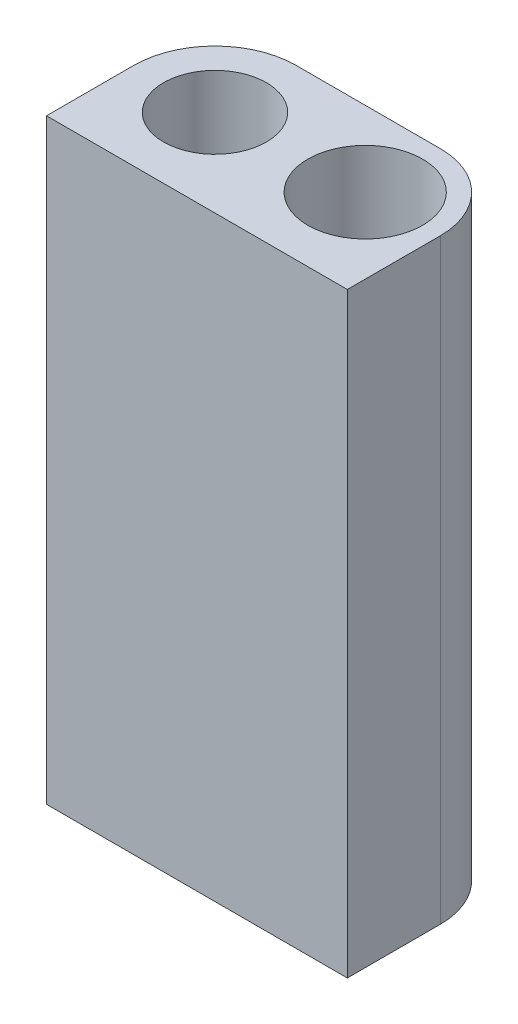
ISO-10303-21;
HEADER;
FILE_DESCRIPTION(('STEP AP214'),'2;1');
FILE_NAME('part.step','',(''),(''),'','','');
FILE_SCHEMA(('AUTOMOTIVE_DESIGN { 1 0 10303 214 1 1 1 1 }'));
ENDSEC;
DATA;
#1=APPLICATION_CONTEXT('core data for automotive mechanical design processes');
#2=APPLICATION_PROTOCOL_DEFINITION('international standard','automotive_design',2000,#1);
#3=PRODUCT_CONTEXT('',#1,'mechanical');
#4=PRODUCT('Part','Part','',(#3));
#5=PRODUCT_RELATED_PRODUCT_CATEGORY('part','',(#4));
#6=PRODUCT_DEFINITION_FORMATION('','',#4);
#7=PRODUCT_DEFINITION_CONTEXT('part definition',#1,'design');
#8=PRODUCT_DEFINITION('design','',#6,#7);
#9=PRODUCT_DEFINITION_SHAPE('','',#8);
#10=(LENGTH_UNIT() NAMED_UNIT(*) SI_UNIT(.MILLI.,.METRE.));
#11=(NAMED_UNIT(*) PLANE_ANGLE_UNIT() SI_UNIT($,.RADIAN.));
#12=(NAMED_UNIT(*) SI_UNIT($,.STERADIAN.) SOLID_ANGLE_UNIT());
#13=UNCERTAINTY_MEASURE_WITH_UNIT(LENGTH_MEASURE(1.E-05),#10,'distance_accuracy_value','');
#14=(GEOMETRIC_REPRESENTATION_CONTEXT(3) GLOBAL_UNCERTAINTY_ASSIGNED_CONTEXT((#13)) GLOBAL_UNIT_ASSIGNED_CONTEXT((#10,
#11,#12)) REPRESENTATION_CONTEXT('',''));
#15=CARTESIAN_POINT('',(0.,0.,0.));
#16=DIRECTION('',(0.,0.,1.));
#17=DIRECTION('',(1.,0.,0.));
#18=AXIS2_PLACEMENT_3D('',#15,#16,#17);
#19=CARTESIAN_POINT('',(0.,40.,-5.45));
#20=DIRECTION('',(0.,0.,-1.));
#21=DIRECTION('',(-1.,0.,0.));
#22=AXIS2_PLACEMENT_3D('',#19,#20,#21);
#23=PLANE('',#22);
#24=DIRECTION('',(1.,0.,0.));
#25=VECTOR('',#24,1.);
#26=CARTESIAN_POINT('',(0.,0.,-5.45));
#27=LINE('',#26,#25);
#28=CARTESIAN_POINT('',(0.,0.,-5.45));
#29=VERTEX_POINT('',#28);
#30=CARTESIAN_POINT('',(9.67916439970916,0.,-5.45));
#31=VERTEX_POINT('',#30);
#32=EDGE_CURVE('E124',#29,#31,#27,.T.);
#33=ORIENTED_EDGE('',*,*,#32,.F.);
#34=DIRECTION('',(0.,-1.,0.));
#35=VECTOR('',#34,1.);
#36=CARTESIAN_POINT('',(0.,40.,-5.45));
#37=LINE('',#36,#35);
#38=CARTESIAN_POINT('',(0.,40.,-5.45));
#39=VERTEX_POINT('',#38);
#40=EDGE_CURVE('E11',#39,#29,#37,.T.);
#41=ORIENTED_EDGE('',*,*,#40,.F.);
#42=DIRECTION('',(1.,0.,0.));
#43=VECTOR('',#42,1.);
#44=CARTESIAN_POINT('',(0.,40.,-5.45));
#45=LINE('',#44,#43);
#46=CARTESIAN_POINT('',(9.67916439970916,40.,-5.45));
#47=VERTEX_POINT('',#46);
#48=EDGE_CURVE('E249',#39,#47,#45,.T.);
#49=ORIENTED_EDGE('',*,*,#48,.T.);
#50=DIRECTION('',(0.,-1.,0.));
#51=VECTOR('',#50,1.);
#52=CARTESIAN_POINT('',(9.67916439970916,40.,-5.45));
#53=LINE('',#52,#51);
#54=EDGE_CURVE('E81',#47,#31,#53,.T.);
#55=ORIENTED_EDGE('',*,*,#54,.T.);
#56=EDGE_LOOP('',(#33,#41,#49,#55));
#57=FACE_BOUND('',#56,.T.);
#58=ADVANCED_FACE('F36',(#57),#23,.T.);
#59=CARTESIAN_POINT('',(0.,40.,0.));
#60=DIRECTION('',(0.,-1.,0.));
#61=DIRECTION('',(0.,0.,-1.));
#62=AXIS2_PLACEMENT_3D('',#59,#60,#61);
#63=CYLINDRICAL_SURFACE('',#62,5.45);
#64=CARTESIAN_POINT('',(0.,0.,0.));
#65=DIRECTION('',(0.,1.,0.));
#66=DIRECTION('',(0.,0.,1.));
#67=AXIS2_PLACEMENT_3D('',#64,#65,#66);
#68=CIRCLE('',#67,5.45);
#69=CARTESIAN_POINT('',(-5.45,0.,0.));
#70=VERTEX_POINT('',#69);
#71=EDGE_CURVE('E127',#29,#70,#68,.T.);
#72=ORIENTED_EDGE('',*,*,#71,.T.);
#73=DIRECTION('',(0.,-1.,0.));
#74=VECTOR('',#73,1.);
#75=CARTESIAN_POINT('',(-5.45,40.,0.));
#76=LINE('',#75,#74);
#77=CARTESIAN_POINT('',(-5.45,40.,0.));
#78=VERTEX_POINT('',#77);
#79=EDGE_CURVE('E45',#78,#70,#76,.T.);
#80=ORIENTED_EDGE('',*,*,#79,.F.);
#81=CARTESIAN_POINT('',(0.,40.,0.));
#82=DIRECTION('',(0.,1.,0.));
#83=DIRECTION('',(0.,0.,1.));
#84=AXIS2_PLACEMENT_3D('',#81,#82,#83);
#85=CIRCLE('',#84,5.45);
#86=EDGE_CURVE('E250',#39,#78,#85,.T.);
#87=ORIENTED_EDGE('',*,*,#86,.F.);
#88=ORIENTED_EDGE('',*,*,#40,.T.);
#89=EDGE_LOOP('',(#72,#80,#87,#88));
#90=FACE_BOUND('',#89,.T.);
#91=ADVANCED_FACE('F147',(#90),#63,.T.);
#92=CARTESIAN_POINT('',(-5.45,40.,0.));
#93=DIRECTION('',(1.,0.,0.));
#94=DIRECTION('',(0.,0.,-1.));
#95=AXIS2_PLACEMENT_3D('',#92,#93,#94);
#96=PLANE('',#95);
#97=DIRECTION('',(0.,0.,1.));
#98=VECTOR('',#97,1.);
#99=CARTESIAN_POINT('',(-5.45,0.,0.));
#100=LINE('',#99,#98);
#101=CARTESIAN_POINT('',(-5.45,0.,5.85));
#102=VERTEX_POINT('',#101);
#103=EDGE_CURVE('E130',#70,#102,#100,.T.);
#104=ORIENTED_EDGE('',*,*,#103,.T.);
#105=DIRECTION('',(0.,-1.,0.));
#106=VECTOR('',#105,1.);
#107=CARTESIAN_POINT('',(-5.45,40.,5.85));
#108=LINE('',#107,#106);
#109=CARTESIAN_POINT('',(-5.45,40.,5.85));
#110=VERTEX_POINT('',#109);
#111=EDGE_CURVE('E111',#110,#102,#108,.T.);
#112=ORIENTED_EDGE('',*,*,#111,.F.);
#113=DIRECTION('',(0.,0.,1.));
#114=VECTOR('',#113,1.);
#115=CARTESIAN_POINT('',(-5.45,40.,0.));
#116=LINE('',#115,#114);
#117=EDGE_CURVE('E99',#78,#110,#116,.T.);
#118=ORIENTED_EDGE('',*,*,#117,.F.);
#119=ORIENTED_EDGE('',*,*,#79,.T.);
#120=EDGE_LOOP('',(#104,#112,#118,#119));
#121=FACE_BOUND('',#120,.T.);
#122=ADVANCED_FACE('F144',(#121),#96,.F.);
#123=CARTESIAN_POINT('',(0.,40.,5.85));
#124=DIRECTION('',(0.,0.,-1.));
#125=DIRECTION('',(-1.,0.,0.));
#126=AXIS2_PLACEMENT_3D('',#123,#124,#125);
#127=PLANE('',#126);
#128=DIRECTION('',(1.,0.,0.));
#129=VECTOR('',#128,1.);
#130=CARTESIAN_POINT('',(0.,0.,5.85));
#131=LINE('',#130,#129);
#132=CARTESIAN_POINT('',(14.7291643997092,0.,5.85));
#133=VERTEX_POINT('',#132);
#134=EDGE_CURVE('E107',#102,#133,#131,.T.);
#135=ORIENTED_EDGE('',*,*,#134,.T.);
#136=DIRECTION('',(0.,-1.,0.));
#137=VECTOR('',#136,1.);
#138=CARTESIAN_POINT('',(14.7291643997092,40.,5.85));
#139=LINE('',#138,#137);
#140=CARTESIAN_POINT('',(14.7291643997092,40.,5.85));
#141=VERTEX_POINT('',#140);
#142=EDGE_CURVE('E105',#141,#133,#139,.T.);
#143=ORIENTED_EDGE('',*,*,#142,.F.);
#144=DIRECTION('',(1.,0.,0.));
#145=VECTOR('',#144,1.);
#146=CARTESIAN_POINT('',(0.,40.,5.85));
#147=LINE('',#146,#145);
#148=EDGE_CURVE('E93',#110,#141,#147,.T.);
#149=ORIENTED_EDGE('',*,*,#148,.F.);
#150=ORIENTED_EDGE('',*,*,#111,.T.);
#151=EDGE_LOOP('',(#135,#143,#149,#150));
#152=FACE_BOUND('',#151,.T.);
#153=ADVANCED_FACE('F106',(#152),#127,.F.);
#154=CARTESIAN_POINT('',(14.7291643997092,40.,0.));
#155=DIRECTION('',(1.,0.,0.));
#156=DIRECTION('',(0.,0.,-1.));
#157=AXIS2_PLACEMENT_3D('',#154,#155,#156);
#158=PLANE('',#157);
#159=DIRECTION('',(0.,0.,1.));
#160=VECTOR('',#159,1.);
#161=CARTESIAN_POINT('',(14.7291643997092,0.,0.));
#162=LINE('',#161,#160);
#163=CARTESIAN_POINT('',(14.7291643997092,0.,-0.400000000000001));
#164=VERTEX_POINT('',#163);
#165=EDGE_CURVE('E134',#164,#133,#162,.T.);
#166=ORIENTED_EDGE('',*,*,#165,.F.);
#167=DIRECTION('',(0.,-1.,0.));
#168=VECTOR('',#167,1.);
#169=CARTESIAN_POINT('',(14.7291643997092,40.,-0.400000000000001));
#170=LINE('',#169,#168);
#171=CARTESIAN_POINT('',(14.7291643997092,40.,-0.400000000000001));
#172=VERTEX_POINT('',#171);
#173=EDGE_CURVE('E74',#172,#164,#170,.T.);
#174=ORIENTED_EDGE('',*,*,#173,.F.);
#175=DIRECTION('',(0.,0.,1.));
#176=VECTOR('',#175,1.);
#177=CARTESIAN_POINT('',(14.7291643997092,40.,0.));
#178=LINE('',#177,#176);
#179=EDGE_CURVE('E97',#172,#141,#178,.T.);
#180=ORIENTED_EDGE('',*,*,#179,.T.);
#181=ORIENTED_EDGE('',*,*,#142,.T.);
#182=EDGE_LOOP('',(#166,#174,#180,#181));
#183=FACE_BOUND('',#182,.T.);
#184=ADVANCED_FACE('F113',(#183),#158,.T.);
#185=CARTESIAN_POINT('',(9.67916439970916,40.,-0.4));
#186=DIRECTION('',(0.,-1.,0.));
#187=DIRECTION('',(0.,0.,-1.));
#188=AXIS2_PLACEMENT_3D('',#185,#186,#187);
#189=CYLINDRICAL_SURFACE('',#188,3.85);
#190=CARTESIAN_POINT('',(9.67916439970916,40.,-0.4));
#191=DIRECTION('',(0.,1.,0.));
#192=DIRECTION('',(0.,0.,1.));
#193=AXIS2_PLACEMENT_3D('',#190,#191,#192);
#194=CIRCLE('',#193,3.85);
#195=CARTESIAN_POINT('',(9.67916439970916,40.,3.45));
#196=VERTEX_POINT('',#195);
#197=EDGE_CURVE('E170',#196,#196,#194,.T.);
#198=ORIENTED_EDGE('',*,*,#197,.T.);
#199=EDGE_LOOP('',(#198));
#200=FACE_BOUND('',#199,.T.);
#201=CARTESIAN_POINT('',(9.67916439970916,0.,-0.4));
#202=DIRECTION('',(0.,1.,0.));
#203=DIRECTION('',(0.,0.,1.));
#204=AXIS2_PLACEMENT_3D('',#201,#202,#203);
#205=CIRCLE('',#204,3.85);
#206=CARTESIAN_POINT('',(9.67916439970916,0.,3.45));
#207=VERTEX_POINT('',#206);
#208=EDGE_CURVE('E121',#207,#207,#205,.T.);
#209=ORIENTED_EDGE('',*,*,#208,.F.);
#210=EDGE_LOOP('',(#209));
#211=FACE_BOUND('',#210,.T.);
#212=ADVANCED_FACE('F157',(#200,#211),#189,.F.);
#213=CARTESIAN_POINT('',(0.,40.,0.));
#214=DIRECTION('',(0.,-1.,0.));
#215=DIRECTION('',(0.,0.,-1.));
#216=AXIS2_PLACEMENT_3D('',#213,#214,#215);
#217=CYLINDRICAL_SURFACE('',#216,3.45);
#218=CARTESIAN_POINT('',(0.,40.,0.));
#219=DIRECTION('',(0.,1.,0.));
#220=DIRECTION('',(0.,0.,1.));
#221=AXIS2_PLACEMENT_3D('',#218,#219,#220);
#222=CIRCLE('',#221,3.45);
#223=CARTESIAN_POINT('',(0.,40.,3.45));
#224=VERTEX_POINT('',#223);
#225=EDGE_CURVE('E138',#224,#224,#222,.T.);
#226=ORIENTED_EDGE('',*,*,#225,.T.);
#227=EDGE_LOOP('',(#226));
#228=FACE_BOUND('',#227,.T.);
#229=CARTESIAN_POINT('',(0.,0.,0.));
#230=DIRECTION('',(0.,1.,0.));
#231=DIRECTION('',(0.,0.,1.));
#232=AXIS2_PLACEMENT_3D('',#229,#230,#231);
#233=CIRCLE('',#232,3.45);
#234=CARTESIAN_POINT('',(0.,0.,3.45));
#235=VERTEX_POINT('',#234);
#236=EDGE_CURVE('E118',#235,#235,#233,.T.);
#237=ORIENTED_EDGE('',*,*,#236,.F.);
#238=EDGE_LOOP('',(#237));
#239=FACE_BOUND('',#238,.T.);
#240=ADVANCED_FACE('F38',(#228,#239),#217,.F.);
#241=CARTESIAN_POINT('',(9.67916439970916,40.,-0.4));
#242=DIRECTION('',(0.,-1.,0.));
#243=DIRECTION('',(0.,0.,-1.));
#244=AXIS2_PLACEMENT_3D('',#241,#242,#243);
#245=CYLINDRICAL_SURFACE('',#244,5.05);
#246=CARTESIAN_POINT('',(9.67916439970916,0.,-0.4));
#247=DIRECTION('',(0.,1.,0.));
#248=DIRECTION('',(0.,0.,1.));
#249=AXIS2_PLACEMENT_3D('',#246,#247,#248);
#250=CIRCLE('',#249,5.05);
#251=EDGE_CURVE('E136',#164,#31,#250,.T.);
#252=ORIENTED_EDGE('',*,*,#251,.T.);
#253=ORIENTED_EDGE('',*,*,#54,.F.);
#254=CARTESIAN_POINT('',(9.67916439970916,40.,-0.4));
#255=DIRECTION('',(0.,1.,0.));
#256=DIRECTION('',(0.,0.,1.));
#257=AXIS2_PLACEMENT_3D('',#254,#255,#256);
#258=CIRCLE('',#257,5.05);
#259=EDGE_CURVE('E53',#172,#47,#258,.T.);
#260=ORIENTED_EDGE('',*,*,#259,.F.);
#261=ORIENTED_EDGE('',*,*,#173,.T.);
#262=EDGE_LOOP('',(#252,#253,#260,#261));
#263=FACE_BOUND('',#262,.T.);
#264=ADVANCED_FACE('F164',(#263),#245,.T.);
#265=CARTESIAN_POINT('',(0.,40.,0.));
#266=DIRECTION('',(0.,1.,0.));
#267=DIRECTION('',(0.,0.,1.));
#268=AXIS2_PLACEMENT_3D('',#265,#266,#267);
#269=PLANE('',#268);
#270=ORIENTED_EDGE('',*,*,#225,.F.);
#271=EDGE_LOOP('',(#270));
#272=FACE_BOUND('',#271,.T.);
#273=ORIENTED_EDGE('',*,*,#197,.F.);
#274=EDGE_LOOP('',(#273));
#275=FACE_BOUND('',#274,.T.);
#276=ORIENTED_EDGE('',*,*,#48,.F.);
#277=ORIENTED_EDGE('',*,*,#86,.T.);
#278=ORIENTED_EDGE('',*,*,#117,.T.);
#279=ORIENTED_EDGE('',*,*,#148,.T.);
#280=ORIENTED_EDGE('',*,*,#179,.F.);
#281=ORIENTED_EDGE('',*,*,#259,.T.);
#282=EDGE_LOOP('',(#276,#277,#278,#279,#280,#281));
#283=FACE_BOUND('',#282,.T.);
#284=ADVANCED_FACE('F95',(#272,#275,#283),#269,.T.);
#285=CARTESIAN_POINT('',(0.,0.,0.));
#286=DIRECTION('',(0.,1.,0.));
#287=DIRECTION('',(0.,0.,1.));
#288=AXIS2_PLACEMENT_3D('',#285,#286,#287);
#289=PLANE('',#288);
#290=ORIENTED_EDGE('',*,*,#236,.T.);
#291=EDGE_LOOP('',(#290));
#292=FACE_BOUND('',#291,.T.);
#293=ORIENTED_EDGE('',*,*,#208,.T.);
#294=EDGE_LOOP('',(#293));
#295=FACE_BOUND('',#294,.T.);
#296=ORIENTED_EDGE('',*,*,#32,.T.);
#297=ORIENTED_EDGE('',*,*,#251,.F.);
#298=ORIENTED_EDGE('',*,*,#165,.T.);
#299=ORIENTED_EDGE('',*,*,#134,.F.);
#300=ORIENTED_EDGE('',*,*,#103,.F.);
#301=ORIENTED_EDGE('',*,*,#71,.F.);
#302=EDGE_LOOP('',(#296,#297,#298,#299,#300,#301));
#303=FACE_BOUND('',#302,.T.);
#304=ADVANCED_FACE('F149',(#292,#295,#303),#289,.F.);
#305=CLOSED_SHELL('',(#58,#91,#122,#153,#184,#212,#240,#264,#284,#304));
#306=MANIFOLD_SOLID_BREP('B2',#305);
#307=ADVANCED_BREP_SHAPE_REPRESENTATION('',(#18,#306),#14);
#308=SHAPE_DEFINITION_REPRESENTATION(#9,#307);
ENDSEC;
END-ISO-10303-21;
